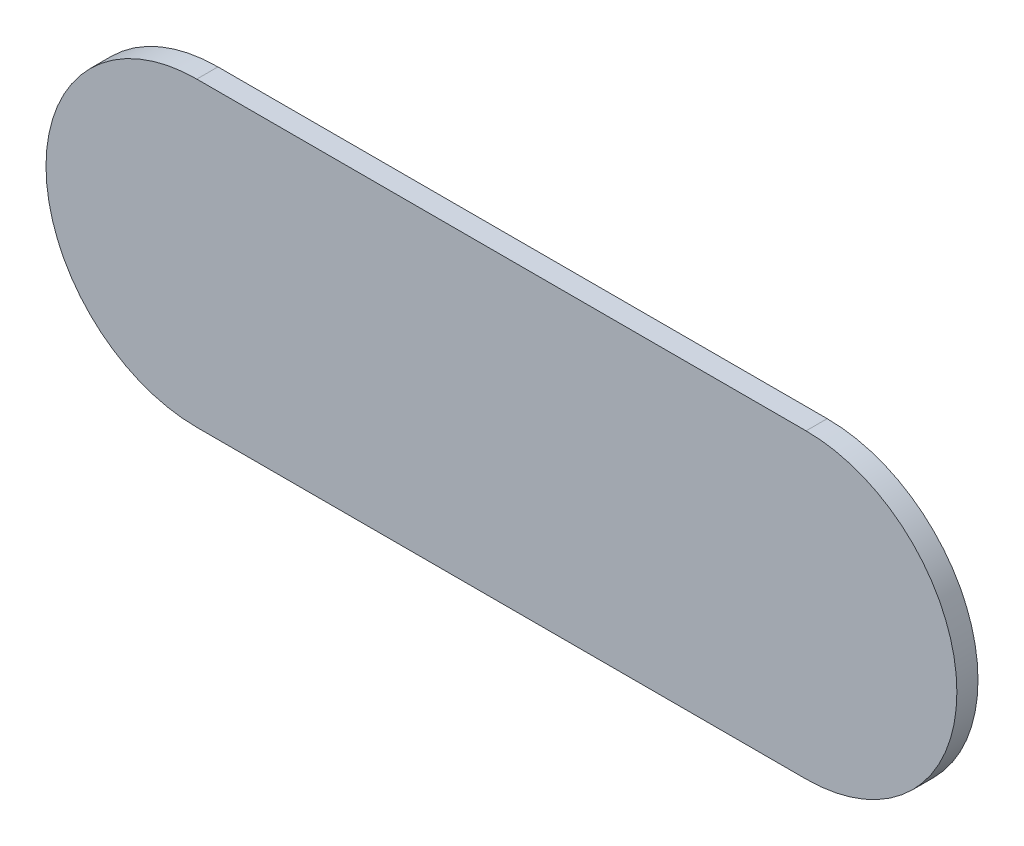
ISO-10303-21;
HEADER;
FILE_DESCRIPTION(('STEP AP214'),'2;1');
FILE_NAME('part.step','',(''),(''),'','','');
FILE_SCHEMA(('AUTOMOTIVE_DESIGN { 1 0 10303 214 1 1 1 1 }'));
ENDSEC;
DATA;
#1=APPLICATION_CONTEXT('core data for automotive mechanical design processes');
#2=APPLICATION_PROTOCOL_DEFINITION('international standard','automotive_design',2000,#1);
#3=PRODUCT_CONTEXT('',#1,'mechanical');
#4=PRODUCT('Part','Part','',(#3));
#5=PRODUCT_RELATED_PRODUCT_CATEGORY('part','',(#4));
#6=PRODUCT_DEFINITION_FORMATION('','',#4);
#7=PRODUCT_DEFINITION_CONTEXT('part definition',#1,'design');
#8=PRODUCT_DEFINITION('design','',#6,#7);
#9=PRODUCT_DEFINITION_SHAPE('','',#8);
#10=(LENGTH_UNIT() NAMED_UNIT(*) SI_UNIT(.MILLI.,.METRE.));
#11=(NAMED_UNIT(*) PLANE_ANGLE_UNIT() SI_UNIT($,.RADIAN.));
#12=(NAMED_UNIT(*) SI_UNIT($,.STERADIAN.) SOLID_ANGLE_UNIT());
#13=UNCERTAINTY_MEASURE_WITH_UNIT(LENGTH_MEASURE(1.E-05),#10,'distance_accuracy_value','');
#14=(GEOMETRIC_REPRESENTATION_CONTEXT(3) GLOBAL_UNCERTAINTY_ASSIGNED_CONTEXT((#13)) GLOBAL_UNIT_ASSIGNED_CONTEXT((#10,
#11,#12)) REPRESENTATION_CONTEXT('',''));
#15=CARTESIAN_POINT('',(0.,0.,0.));
#16=DIRECTION('',(0.,0.,1.));
#17=DIRECTION('',(1.,0.,0.));
#18=AXIS2_PLACEMENT_3D('',#15,#16,#17);
#19=CARTESIAN_POINT('',(135.2,-119.92,1.635));
#20=DIRECTION('',(0.,0.,1.));
#21=DIRECTION('',(1.,0.,0.));
#22=AXIS2_PLACEMENT_3D('',#19,#20,#21);
#23=PLANE('',#22);
#24=DIRECTION('',(1.,0.,0.));
#25=VECTOR('',#24,1.);
#26=CARTESIAN_POINT('',(135.2,-119.92,1.635));
#27=LINE('',#26,#25);
#28=CARTESIAN_POINT('',(135.2,-119.92,1.635));
#29=VERTEX_POINT('',#28);
#30=CARTESIAN_POINT('',(136.21,-119.92,1.635));
#31=VERTEX_POINT('',#30);
#32=EDGE_CURVE('E81',#29,#31,#27,.T.);
#33=ORIENTED_EDGE('',*,*,#32,.T.);
#34=CARTESIAN_POINT('',(136.21,-119.67,1.635));
#35=DIRECTION('',(0.,0.,1.));
#36=DIRECTION('',(0.,-1.,0.));
#37=AXIS2_PLACEMENT_3D('',#34,#35,#36);
#38=CIRCLE('',#37,0.25);
#39=CARTESIAN_POINT('',(136.21,-119.42,1.635));
#40=VERTEX_POINT('',#39);
#41=EDGE_CURVE('E99',#31,#40,#38,.T.);
#42=ORIENTED_EDGE('',*,*,#41,.T.);
#43=DIRECTION('',(-1.,0.,0.));
#44=VECTOR('',#43,1.);
#45=CARTESIAN_POINT('',(136.21,-119.42,1.635));
#46=LINE('',#45,#44);
#47=CARTESIAN_POINT('',(135.2,-119.42,1.635));
#48=VERTEX_POINT('',#47);
#49=EDGE_CURVE('E74',#40,#48,#46,.T.);
#50=ORIENTED_EDGE('',*,*,#49,.T.);
#51=CARTESIAN_POINT('',(135.2,-119.67,1.635));
#52=DIRECTION('',(0.,0.,1.));
#53=DIRECTION('',(0.,1.,0.));
#54=AXIS2_PLACEMENT_3D('',#51,#52,#53);
#55=CIRCLE('',#54,0.25);
#56=EDGE_CURVE('E11',#48,#29,#55,.T.);
#57=ORIENTED_EDGE('',*,*,#56,.T.);
#58=EDGE_LOOP('',(#33,#42,#50,#57));
#59=FACE_BOUND('',#58,.T.);
#60=ADVANCED_FACE('F17',(#59),#23,.T.);
#61=CARTESIAN_POINT('',(135.2,-119.92,1.6));
#62=DIRECTION('',(0.,0.,1.));
#63=DIRECTION('',(1.,0.,0.));
#64=AXIS2_PLACEMENT_3D('',#61,#62,#63);
#65=PLANE('',#64);
#66=CARTESIAN_POINT('',(135.2,-119.67,1.6));
#67=DIRECTION('',(0.,0.,1.));
#68=DIRECTION('',(0.,1.,0.));
#69=AXIS2_PLACEMENT_3D('',#66,#67,#68);
#70=CIRCLE('',#69,0.25);
#71=CARTESIAN_POINT('',(135.2,-119.42,1.6));
#72=VERTEX_POINT('',#71);
#73=CARTESIAN_POINT('',(135.2,-119.92,1.6));
#74=VERTEX_POINT('',#73);
#75=EDGE_CURVE('E25',#72,#74,#70,.T.);
#76=ORIENTED_EDGE('',*,*,#75,.F.);
#77=DIRECTION('',(-1.,0.,0.));
#78=VECTOR('',#77,1.);
#79=CARTESIAN_POINT('',(136.21,-119.42,1.6));
#80=LINE('',#79,#78);
#81=CARTESIAN_POINT('',(136.21,-119.42,1.6));
#82=VERTEX_POINT('',#81);
#83=EDGE_CURVE('E103',#82,#72,#80,.T.);
#84=ORIENTED_EDGE('',*,*,#83,.F.);
#85=CARTESIAN_POINT('',(136.21,-119.67,1.6));
#86=DIRECTION('',(0.,0.,1.));
#87=DIRECTION('',(0.,-1.,0.));
#88=AXIS2_PLACEMENT_3D('',#85,#86,#87);
#89=CIRCLE('',#88,0.25);
#90=CARTESIAN_POINT('',(136.21,-119.92,1.6));
#91=VERTEX_POINT('',#90);
#92=EDGE_CURVE('E83',#91,#82,#89,.T.);
#93=ORIENTED_EDGE('',*,*,#92,.F.);
#94=DIRECTION('',(1.,0.,0.));
#95=VECTOR('',#94,1.);
#96=CARTESIAN_POINT('',(135.2,-119.92,1.6));
#97=LINE('',#96,#95);
#98=EDGE_CURVE('E79',#74,#91,#97,.T.);
#99=ORIENTED_EDGE('',*,*,#98,.F.);
#100=EDGE_LOOP('',(#76,#84,#93,#99));
#101=FACE_BOUND('',#100,.T.);
#102=ADVANCED_FACE('F85',(#101),#65,.F.);
#103=CARTESIAN_POINT('',(135.2,-119.67,1.6));
#104=DIRECTION('',(0.,0.,-1.));
#105=DIRECTION('',(0.,1.,0.));
#106=AXIS2_PLACEMENT_3D('',#103,#104,#105);
#107=CYLINDRICAL_SURFACE('',#106,0.25);
#108=ORIENTED_EDGE('',*,*,#75,.T.);
#109=DIRECTION('',(0.,0.,1.));
#110=VECTOR('',#109,1.);
#111=CARTESIAN_POINT('',(135.2,-119.92,1.6));
#112=LINE('',#111,#110);
#113=EDGE_CURVE('E68',#74,#29,#112,.T.);
#114=ORIENTED_EDGE('',*,*,#113,.T.);
#115=ORIENTED_EDGE('',*,*,#56,.F.);
#116=DIRECTION('',(0.,0.,1.));
#117=VECTOR('',#116,1.);
#118=CARTESIAN_POINT('',(135.2,-119.42,1.6));
#119=LINE('',#118,#117);
#120=EDGE_CURVE('E71',#72,#48,#119,.T.);
#121=ORIENTED_EDGE('',*,*,#120,.F.);
#122=EDGE_LOOP('',(#108,#114,#115,#121));
#123=FACE_BOUND('',#122,.T.);
#124=ADVANCED_FACE('F67',(#123),#107,.T.);
#125=CARTESIAN_POINT('',(136.21,-119.42,1.6));
#126=DIRECTION('',(0.,-1.,0.));
#127=DIRECTION('',(0.,0.,-1.));
#128=AXIS2_PLACEMENT_3D('',#125,#126,#127);
#129=PLANE('',#128);
#130=ORIENTED_EDGE('',*,*,#83,.T.);
#131=ORIENTED_EDGE('',*,*,#120,.T.);
#132=ORIENTED_EDGE('',*,*,#49,.F.);
#133=DIRECTION('',(0.,0.,1.));
#134=VECTOR('',#133,1.);
#135=CARTESIAN_POINT('',(136.21,-119.42,1.6));
#136=LINE('',#135,#134);
#137=EDGE_CURVE('E104',#82,#40,#136,.T.);
#138=ORIENTED_EDGE('',*,*,#137,.F.);
#139=EDGE_LOOP('',(#130,#131,#132,#138));
#140=FACE_BOUND('',#139,.T.);
#141=ADVANCED_FACE('F118',(#140),#129,.F.);
#142=CARTESIAN_POINT('',(136.21,-119.67,1.6));
#143=DIRECTION('',(0.,0.,-1.));
#144=DIRECTION('',(0.,-1.,0.));
#145=AXIS2_PLACEMENT_3D('',#142,#143,#144);
#146=CYLINDRICAL_SURFACE('',#145,0.25);
#147=ORIENTED_EDGE('',*,*,#92,.T.);
#148=ORIENTED_EDGE('',*,*,#137,.T.);
#149=ORIENTED_EDGE('',*,*,#41,.F.);
#150=DIRECTION('',(0.,0.,1.));
#151=VECTOR('',#150,1.);
#152=CARTESIAN_POINT('',(136.21,-119.92,1.6));
#153=LINE('',#152,#151);
#154=EDGE_CURVE('E89',#91,#31,#153,.T.);
#155=ORIENTED_EDGE('',*,*,#154,.F.);
#156=EDGE_LOOP('',(#147,#148,#149,#155));
#157=FACE_BOUND('',#156,.T.);
#158=ADVANCED_FACE('F121',(#157),#146,.T.);
#159=CARTESIAN_POINT('',(135.2,-119.92,1.6));
#160=DIRECTION('',(0.,1.,0.));
#161=DIRECTION('',(1.,0.,0.));
#162=AXIS2_PLACEMENT_3D('',#159,#160,#161);
#163=PLANE('',#162);
#164=ORIENTED_EDGE('',*,*,#98,.T.);
#165=ORIENTED_EDGE('',*,*,#154,.T.);
#166=ORIENTED_EDGE('',*,*,#32,.F.);
#167=ORIENTED_EDGE('',*,*,#113,.F.);
#168=EDGE_LOOP('',(#164,#165,#166,#167));
#169=FACE_BOUND('',#168,.T.);
#170=ADVANCED_FACE('F77',(#169),#163,.F.);
#171=CLOSED_SHELL('',(#60,#102,#124,#141,#158,#170));
#172=MANIFOLD_SOLID_BREP('B1',#171);
#173=ADVANCED_BREP_SHAPE_REPRESENTATION('',(#18,#172),#14);
#174=SHAPE_DEFINITION_REPRESENTATION(#9,#173);
ENDSEC;
END-ISO-10303-21;
